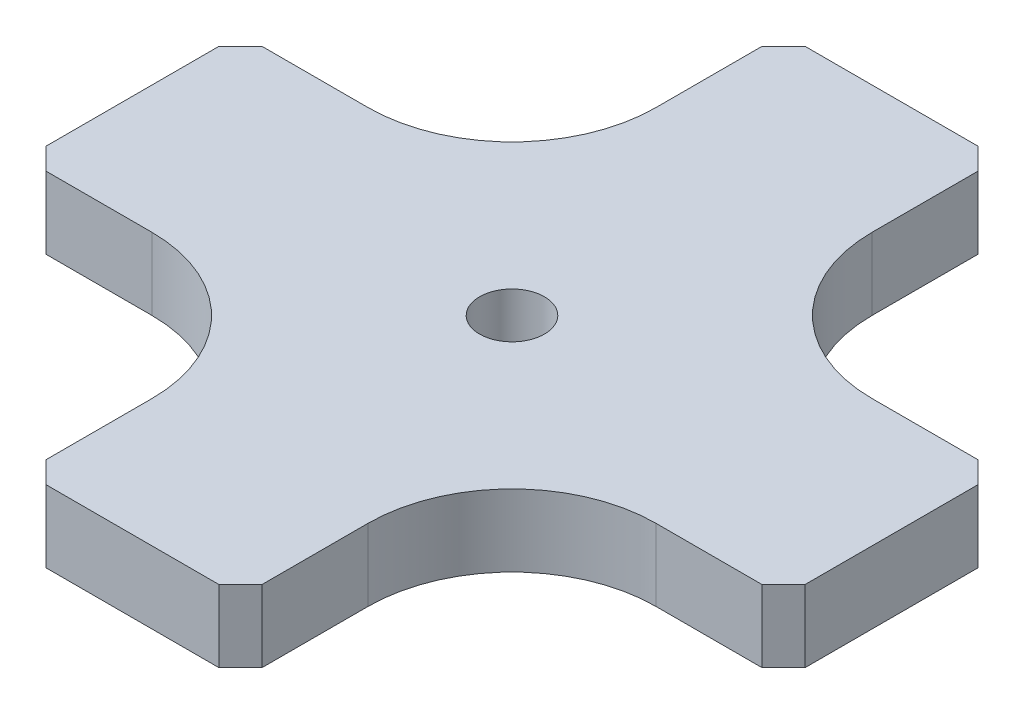
ISO-10303-21;
HEADER;
FILE_DESCRIPTION(('STEP AP214'),'2;1');
FILE_NAME('part.step','',(''),(''),'','','');
FILE_SCHEMA(('AUTOMOTIVE_DESIGN { 1 0 10303 214 1 1 1 1 }'));
ENDSEC;
DATA;
#1=APPLICATION_CONTEXT('core data for automotive mechanical design processes');
#2=APPLICATION_PROTOCOL_DEFINITION('international standard','automotive_design',2000,#1);
#3=PRODUCT_CONTEXT('',#1,'mechanical');
#4=PRODUCT('Part','Part','',(#3));
#5=PRODUCT_RELATED_PRODUCT_CATEGORY('part','',(#4));
#6=PRODUCT_DEFINITION_FORMATION('','',#4);
#7=PRODUCT_DEFINITION_CONTEXT('part definition',#1,'design');
#8=PRODUCT_DEFINITION('design','',#6,#7);
#9=PRODUCT_DEFINITION_SHAPE('','',#8);
#10=(LENGTH_UNIT() NAMED_UNIT(*) SI_UNIT(.MILLI.,.METRE.));
#11=(NAMED_UNIT(*) PLANE_ANGLE_UNIT() SI_UNIT($,.RADIAN.));
#12=(NAMED_UNIT(*) SI_UNIT($,.STERADIAN.) SOLID_ANGLE_UNIT());
#13=UNCERTAINTY_MEASURE_WITH_UNIT(LENGTH_MEASURE(1.E-05),#10,'distance_accuracy_value','');
#14=(GEOMETRIC_REPRESENTATION_CONTEXT(3) GLOBAL_UNCERTAINTY_ASSIGNED_CONTEXT((#13)) GLOBAL_UNIT_ASSIGNED_CONTEXT((#10,
#11,#12)) REPRESENTATION_CONTEXT('',''));
#15=CARTESIAN_POINT('',(0.,0.,0.));
#16=DIRECTION('',(0.,0.,1.));
#17=DIRECTION('',(1.,0.,0.));
#18=AXIS2_PLACEMENT_3D('',#15,#16,#17);
#19=CARTESIAN_POINT('',(26.35,2.5,-7.5));
#20=DIRECTION('',(0.,0.,1.));
#21=DIRECTION('',(1.,0.,0.));
#22=AXIS2_PLACEMENT_3D('',#19,#20,#21);
#23=PLANE('',#22);
#24=DIRECTION('',(-1.,0.,0.));
#25=VECTOR('',#24,1.);
#26=CARTESIAN_POINT('',(26.35,2.5,-7.5));
#27=LINE('',#26,#25);
#28=CARTESIAN_POINT('',(24.85,2.5,-7.5));
#29=VERTEX_POINT('',#28);
#30=CARTESIAN_POINT('',(17.5,2.5,-7.5));
#31=VERTEX_POINT('',#30);
#32=EDGE_CURVE('E271',#29,#31,#27,.T.);
#33=ORIENTED_EDGE('',*,*,#32,.F.);
#34=DIRECTION('',(0.,-1.,0.));
#35=VECTOR('',#34,1.);
#36=CARTESIAN_POINT('',(24.85,2.5,-7.5));
#37=LINE('',#36,#35);
#38=CARTESIAN_POINT('',(24.85,-2.5,-7.5));
#39=VERTEX_POINT('',#38);
#40=EDGE_CURVE('E395',#29,#39,#37,.T.);
#41=ORIENTED_EDGE('',*,*,#40,.T.);
#42=DIRECTION('',(-1.,0.,0.));
#43=VECTOR('',#42,1.);
#44=CARTESIAN_POINT('',(26.35,-2.5,-7.5));
#45=LINE('',#44,#43);
#46=CARTESIAN_POINT('',(17.5,-2.5,-7.5));
#47=VERTEX_POINT('',#46);
#48=EDGE_CURVE('E459',#39,#47,#45,.T.);
#49=ORIENTED_EDGE('',*,*,#48,.T.);
#50=DIRECTION('',(0.,-1.,0.));
#51=VECTOR('',#50,1.);
#52=CARTESIAN_POINT('',(17.5,2.5,-7.5));
#53=LINE('',#52,#51);
#54=EDGE_CURVE('E279',#47,#31,#53,.F.);
#55=ORIENTED_EDGE('',*,*,#54,.T.);
#56=EDGE_LOOP('',(#33,#41,#49,#55));
#57=FACE_BOUND('',#56,.T.);
#58=ADVANCED_FACE('F44',(#57),#23,.F.);
#59=CARTESIAN_POINT('',(7.49999999999998,2.5,-26.35));
#60=DIRECTION('',(-1.,0.,0.));
#61=DIRECTION('',(0.,0.,1.));
#62=AXIS2_PLACEMENT_3D('',#59,#60,#61);
#63=PLANE('',#62);
#64=DIRECTION('',(0.,0.,-1.));
#65=VECTOR('',#64,1.);
#66=CARTESIAN_POINT('',(7.49999999999998,-2.5,-26.35));
#67=LINE('',#66,#65);
#68=CARTESIAN_POINT('',(7.49999999999999,-2.5,-17.5));
#69=VERTEX_POINT('',#68);
#70=CARTESIAN_POINT('',(7.49999999999998,-2.5,-24.85));
#71=VERTEX_POINT('',#70);
#72=EDGE_CURVE('E462',#69,#71,#67,.T.);
#73=ORIENTED_EDGE('',*,*,#72,.T.);
#74=DIRECTION('',(0.,1.,0.));
#75=VECTOR('',#74,1.);
#76=CARTESIAN_POINT('',(7.49999999999998,2.5,-24.85));
#77=LINE('',#76,#75);
#78=CARTESIAN_POINT('',(7.49999999999998,2.5,-24.85));
#79=VERTEX_POINT('',#78);
#80=EDGE_CURVE('E392',#71,#79,#77,.T.);
#81=ORIENTED_EDGE('',*,*,#80,.T.);
#82=DIRECTION('',(0.,0.,-1.));
#83=VECTOR('',#82,1.);
#84=CARTESIAN_POINT('',(7.49999999999998,2.5,-26.35));
#85=LINE('',#84,#83);
#86=CARTESIAN_POINT('',(7.49999999999999,2.5,-17.5));
#87=VERTEX_POINT('',#86);
#88=EDGE_CURVE('E489',#87,#79,#85,.T.);
#89=ORIENTED_EDGE('',*,*,#88,.F.);
#90=DIRECTION('',(0.,-1.,0.));
#91=VECTOR('',#90,1.);
#92=CARTESIAN_POINT('',(7.49999999999999,-2.5,-17.5));
#93=LINE('',#92,#91);
#94=EDGE_CURVE('E275',#87,#69,#93,.T.);
#95=ORIENTED_EDGE('',*,*,#94,.T.);
#96=EDGE_LOOP('',(#73,#81,#89,#95));
#97=FACE_BOUND('',#96,.T.);
#98=ADVANCED_FACE('F536',(#97),#63,.F.);
#99=CARTESIAN_POINT('',(-7.50000000000003,2.5,-26.35));
#100=DIRECTION('',(0.,0.,1.));
#101=DIRECTION('',(1.,0.,0.));
#102=AXIS2_PLACEMENT_3D('',#99,#100,#101);
#103=PLANE('',#102);
#104=DIRECTION('',(-1.,0.,0.));
#105=VECTOR('',#104,1.);
#106=CARTESIAN_POINT('',(-7.50000000000003,-2.5,-26.35));
#107=LINE('',#106,#105);
#108=CARTESIAN_POINT('',(5.99999999999997,-2.5,-26.35));
#109=VERTEX_POINT('',#108);
#110=CARTESIAN_POINT('',(-6.00000000000002,-2.5,-26.35));
#111=VERTEX_POINT('',#110);
#112=EDGE_CURVE('E248',#109,#111,#107,.T.);
#113=ORIENTED_EDGE('',*,*,#112,.T.);
#114=DIRECTION('',(0.,1.,0.));
#115=VECTOR('',#114,1.);
#116=CARTESIAN_POINT('',(-6.00000000000002,2.5,-26.35));
#117=LINE('',#116,#115);
#118=CARTESIAN_POINT('',(-6.00000000000002,2.5,-26.35));
#119=VERTEX_POINT('',#118);
#120=EDGE_CURVE('E389',#111,#119,#117,.T.);
#121=ORIENTED_EDGE('',*,*,#120,.T.);
#122=DIRECTION('',(-1.,0.,0.));
#123=VECTOR('',#122,1.);
#124=CARTESIAN_POINT('',(-7.50000000000003,2.5,-26.35));
#125=LINE('',#124,#123);
#126=CARTESIAN_POINT('',(5.99999999999997,2.5,-26.35));
#127=VERTEX_POINT('',#126);
#128=EDGE_CURVE('E480',#127,#119,#125,.T.);
#129=ORIENTED_EDGE('',*,*,#128,.F.);
#130=DIRECTION('',(0.,-1.,0.));
#131=VECTOR('',#130,1.);
#132=CARTESIAN_POINT('',(5.99999999999997,2.5,-26.35));
#133=LINE('',#132,#131);
#134=EDGE_CURVE('E385',#127,#109,#133,.T.);
#135=ORIENTED_EDGE('',*,*,#134,.T.);
#136=EDGE_LOOP('',(#113,#121,#129,#135));
#137=FACE_BOUND('',#136,.T.);
#138=ADVANCED_FACE('F470',(#137),#103,.F.);
#139=CARTESIAN_POINT('',(-7.50000000000003,2.5,-26.35));
#140=DIRECTION('',(1.,0.,0.));
#141=DIRECTION('',(0.,0.,-1.));
#142=AXIS2_PLACEMENT_3D('',#139,#140,#141);
#143=PLANE('',#142);
#144=DIRECTION('',(0.,0.,1.));
#145=VECTOR('',#144,1.);
#146=CARTESIAN_POINT('',(-7.50000000000003,2.5,-26.35));
#147=LINE('',#146,#145);
#148=CARTESIAN_POINT('',(-7.50000000000003,2.5,-24.85));
#149=VERTEX_POINT('',#148);
#150=CARTESIAN_POINT('',(-7.50000000000002,2.5,-17.5));
#151=VERTEX_POINT('',#150);
#152=EDGE_CURVE('E479',#149,#151,#147,.T.);
#153=ORIENTED_EDGE('',*,*,#152,.F.);
#154=DIRECTION('',(0.,-1.,0.));
#155=VECTOR('',#154,1.);
#156=CARTESIAN_POINT('',(-7.50000000000003,2.5,-24.85));
#157=LINE('',#156,#155);
#158=CARTESIAN_POINT('',(-7.50000000000003,-2.5,-24.85));
#159=VERTEX_POINT('',#158);
#160=EDGE_CURVE('E381',#149,#159,#157,.T.);
#161=ORIENTED_EDGE('',*,*,#160,.T.);
#162=DIRECTION('',(0.,0.,1.));
#163=VECTOR('',#162,1.);
#164=CARTESIAN_POINT('',(-7.50000000000003,-2.5,-26.35));
#165=LINE('',#164,#163);
#166=CARTESIAN_POINT('',(-7.50000000000002,-2.5,-17.5));
#167=VERTEX_POINT('',#166);
#168=EDGE_CURVE('E241',#159,#167,#165,.T.);
#169=ORIENTED_EDGE('',*,*,#168,.T.);
#170=DIRECTION('',(0.,-1.,0.));
#171=VECTOR('',#170,1.);
#172=CARTESIAN_POINT('',(-7.50000000000002,2.5,-17.5));
#173=LINE('',#172,#171);
#174=EDGE_CURVE('E216',#167,#151,#173,.F.);
#175=ORIENTED_EDGE('',*,*,#174,.T.);
#176=EDGE_LOOP('',(#153,#161,#169,#175));
#177=FACE_BOUND('',#176,.T.);
#178=ADVANCED_FACE('F482',(#177),#143,.F.);
#179=CARTESIAN_POINT('',(-26.35,2.5,-7.5));
#180=DIRECTION('',(0.,0.,1.));
#181=DIRECTION('',(1.,0.,0.));
#182=AXIS2_PLACEMENT_3D('',#179,#180,#181);
#183=PLANE('',#182);
#184=DIRECTION('',(-1.,0.,0.));
#185=VECTOR('',#184,1.);
#186=CARTESIAN_POINT('',(-26.35,-2.5,-7.5));
#187=LINE('',#186,#185);
#188=CARTESIAN_POINT('',(-17.5,-2.5,-7.5));
#189=VERTEX_POINT('',#188);
#190=CARTESIAN_POINT('',(-24.85,-2.5,-7.5));
#191=VERTEX_POINT('',#190);
#192=EDGE_CURVE('E228',#189,#191,#187,.T.);
#193=ORIENTED_EDGE('',*,*,#192,.T.);
#194=DIRECTION('',(0.,1.,0.));
#195=VECTOR('',#194,1.);
#196=CARTESIAN_POINT('',(-24.85,2.5,-7.5));
#197=LINE('',#196,#195);
#198=CARTESIAN_POINT('',(-24.85,2.5,-7.5));
#199=VERTEX_POINT('',#198);
#200=EDGE_CURVE('E378',#191,#199,#197,.T.);
#201=ORIENTED_EDGE('',*,*,#200,.T.);
#202=DIRECTION('',(-1.,0.,0.));
#203=VECTOR('',#202,1.);
#204=CARTESIAN_POINT('',(-26.35,2.5,-7.5));
#205=LINE('',#204,#203);
#206=CARTESIAN_POINT('',(-17.5,2.5,-7.5));
#207=VERTEX_POINT('',#206);
#208=EDGE_CURVE('E231',#207,#199,#205,.T.);
#209=ORIENTED_EDGE('',*,*,#208,.F.);
#210=DIRECTION('',(0.,-1.,0.));
#211=VECTOR('',#210,1.);
#212=CARTESIAN_POINT('',(-17.5,-2.5,-7.5));
#213=LINE('',#212,#211);
#214=EDGE_CURVE('E214',#207,#189,#213,.T.);
#215=ORIENTED_EDGE('',*,*,#214,.T.);
#216=EDGE_LOOP('',(#193,#201,#209,#215));
#217=FACE_BOUND('',#216,.T.);
#218=ADVANCED_FACE('F227',(#217),#183,.F.);
#219=CARTESIAN_POINT('',(-26.35,2.5,7.50000000000001));
#220=DIRECTION('',(1.,0.,0.));
#221=DIRECTION('',(0.,0.,-1.));
#222=AXIS2_PLACEMENT_3D('',#219,#220,#221);
#223=PLANE('',#222);
#224=DIRECTION('',(0.,0.,1.));
#225=VECTOR('',#224,1.);
#226=CARTESIAN_POINT('',(-26.35,-2.5,7.50000000000001));
#227=LINE('',#226,#225);
#228=CARTESIAN_POINT('',(-26.35,-2.5,-5.99999999999999));
#229=VERTEX_POINT('',#228);
#230=CARTESIAN_POINT('',(-26.35,-2.5,6.));
#231=VERTEX_POINT('',#230);
#232=EDGE_CURVE('E240',#229,#231,#227,.T.);
#233=ORIENTED_EDGE('',*,*,#232,.T.);
#234=DIRECTION('',(0.,1.,0.));
#235=VECTOR('',#234,1.);
#236=CARTESIAN_POINT('',(-26.35,2.5,6.));
#237=LINE('',#236,#235);
#238=CARTESIAN_POINT('',(-26.35,2.5,6.));
#239=VERTEX_POINT('',#238);
#240=EDGE_CURVE('E352',#231,#239,#237,.T.);
#241=ORIENTED_EDGE('',*,*,#240,.T.);
#242=DIRECTION('',(0.,0.,1.));
#243=VECTOR('',#242,1.);
#244=CARTESIAN_POINT('',(-26.35,2.5,7.50000000000001));
#245=LINE('',#244,#243);
#246=CARTESIAN_POINT('',(-26.35,2.5,-5.99999999999999));
#247=VERTEX_POINT('',#246);
#248=EDGE_CURVE('E487',#247,#239,#245,.T.);
#249=ORIENTED_EDGE('',*,*,#248,.F.);
#250=DIRECTION('',(0.,-1.,0.));
#251=VECTOR('',#250,1.);
#252=CARTESIAN_POINT('',(-26.35,2.5,-5.99999999999999));
#253=LINE('',#252,#251);
#254=EDGE_CURVE('E348',#247,#229,#253,.T.);
#255=ORIENTED_EDGE('',*,*,#254,.T.);
#256=EDGE_LOOP('',(#233,#241,#249,#255));
#257=FACE_BOUND('',#256,.T.);
#258=ADVANCED_FACE('F520',(#257),#223,.F.);
#259=CARTESIAN_POINT('',(-26.35,2.5,7.50000000000001));
#260=DIRECTION('',(0.,0.,-1.));
#261=DIRECTION('',(-1.,0.,0.));
#262=AXIS2_PLACEMENT_3D('',#259,#260,#261);
#263=PLANE('',#262);
#264=DIRECTION('',(1.,0.,0.));
#265=VECTOR('',#264,1.);
#266=CARTESIAN_POINT('',(-26.35,2.5,7.50000000000001));
#267=LINE('',#266,#265);
#268=CARTESIAN_POINT('',(-24.85,2.5,7.50000000000001));
#269=VERTEX_POINT('',#268);
#270=CARTESIAN_POINT('',(-17.5,2.5,7.5));
#271=VERTEX_POINT('',#270);
#272=EDGE_CURVE('E495',#269,#271,#267,.T.);
#273=ORIENTED_EDGE('',*,*,#272,.F.);
#274=DIRECTION('',(0.,-1.,0.));
#275=VECTOR('',#274,1.);
#276=CARTESIAN_POINT('',(-24.85,2.5,7.50000000000001));
#277=LINE('',#276,#275);
#278=CARTESIAN_POINT('',(-24.85,-2.5,7.50000000000001));
#279=VERTEX_POINT('',#278);
#280=EDGE_CURVE('E321',#269,#279,#277,.T.);
#281=ORIENTED_EDGE('',*,*,#280,.T.);
#282=DIRECTION('',(1.,0.,0.));
#283=VECTOR('',#282,1.);
#284=CARTESIAN_POINT('',(-26.35,-2.5,7.50000000000001));
#285=LINE('',#284,#283);
#286=CARTESIAN_POINT('',(-17.5,-2.5,7.5));
#287=VERTEX_POINT('',#286);
#288=EDGE_CURVE('E246',#279,#287,#285,.T.);
#289=ORIENTED_EDGE('',*,*,#288,.T.);
#290=DIRECTION('',(0.,-1.,0.));
#291=VECTOR('',#290,1.);
#292=CARTESIAN_POINT('',(-17.5,2.5,7.5));
#293=LINE('',#292,#291);
#294=EDGE_CURVE('E222',#287,#271,#293,.F.);
#295=ORIENTED_EDGE('',*,*,#294,.T.);
#296=EDGE_LOOP('',(#273,#281,#289,#295));
#297=FACE_BOUND('',#296,.T.);
#298=ADVANCED_FACE('F512',(#297),#263,.F.);
#299=CARTESIAN_POINT('',(-7.50000000000003,2.5,26.35));
#300=DIRECTION('',(1.,0.,0.));
#301=DIRECTION('',(0.,0.,-1.));
#302=AXIS2_PLACEMENT_3D('',#299,#300,#301);
#303=PLANE('',#302);
#304=DIRECTION('',(0.,0.,1.));
#305=VECTOR('',#304,1.);
#306=CARTESIAN_POINT('',(-7.50000000000003,-2.5,26.35));
#307=LINE('',#306,#305);
#308=CARTESIAN_POINT('',(-7.50000000000002,-2.5,17.5));
#309=VERTEX_POINT('',#308);
#310=CARTESIAN_POINT('',(-7.50000000000003,-2.5,24.85));
#311=VERTEX_POINT('',#310);
#312=EDGE_CURVE('E254',#309,#311,#307,.T.);
#313=ORIENTED_EDGE('',*,*,#312,.T.);
#314=DIRECTION('',(0.,1.,0.));
#315=VECTOR('',#314,1.);
#316=CARTESIAN_POINT('',(-7.50000000000003,2.5,24.85));
#317=LINE('',#316,#315);
#318=CARTESIAN_POINT('',(-7.50000000000003,2.5,24.85));
#319=VERTEX_POINT('',#318);
#320=EDGE_CURVE('E11',#311,#319,#317,.T.);
#321=ORIENTED_EDGE('',*,*,#320,.T.);
#322=DIRECTION('',(0.,0.,1.));
#323=VECTOR('',#322,1.);
#324=CARTESIAN_POINT('',(-7.50000000000003,2.5,26.35));
#325=LINE('',#324,#323);
#326=CARTESIAN_POINT('',(-7.50000000000002,2.5,17.5));
#327=VERTEX_POINT('',#326);
#328=EDGE_CURVE('E434',#327,#319,#325,.T.);
#329=ORIENTED_EDGE('',*,*,#328,.F.);
#330=DIRECTION('',(0.,-1.,0.));
#331=VECTOR('',#330,1.);
#332=CARTESIAN_POINT('',(-7.50000000000002,-2.5,17.5));
#333=LINE('',#332,#331);
#334=EDGE_CURVE('E291',#327,#309,#333,.T.);
#335=ORIENTED_EDGE('',*,*,#334,.T.);
#336=EDGE_LOOP('',(#313,#321,#329,#335));
#337=FACE_BOUND('',#336,.T.);
#338=ADVANCED_FACE('F506',(#337),#303,.F.);
#339=CARTESIAN_POINT('',(-7.50000000000003,2.5,26.35));
#340=DIRECTION('',(0.,0.,-1.));
#341=DIRECTION('',(-1.,0.,0.));
#342=AXIS2_PLACEMENT_3D('',#339,#340,#341);
#343=PLANE('',#342);
#344=DIRECTION('',(1.,0.,0.));
#345=VECTOR('',#344,1.);
#346=CARTESIAN_POINT('',(-7.50000000000003,-2.5,26.35));
#347=LINE('',#346,#345);
#348=CARTESIAN_POINT('',(-6.00000000000002,-2.5,26.35));
#349=VERTEX_POINT('',#348);
#350=CARTESIAN_POINT('',(6.00000000000002,-2.5,26.35));
#351=VERTEX_POINT('',#350);
#352=EDGE_CURVE('E258',#349,#351,#347,.T.);
#353=ORIENTED_EDGE('',*,*,#352,.T.);
#354=DIRECTION('',(0.,1.,0.));
#355=VECTOR('',#354,1.);
#356=CARTESIAN_POINT('',(6.00000000000002,2.5,26.35));
#357=LINE('',#356,#355);
#358=CARTESIAN_POINT('',(6.00000000000002,2.5,26.35));
#359=VERTEX_POINT('',#358);
#360=EDGE_CURVE('E55',#351,#359,#357,.T.);
#361=ORIENTED_EDGE('',*,*,#360,.T.);
#362=DIRECTION('',(1.,0.,0.));
#363=VECTOR('',#362,1.);
#364=CARTESIAN_POINT('',(-7.50000000000003,2.5,26.35));
#365=LINE('',#364,#363);
#366=CARTESIAN_POINT('',(-6.00000000000002,2.5,26.35));
#367=VERTEX_POINT('',#366);
#368=EDGE_CURVE('E422',#367,#359,#365,.T.);
#369=ORIENTED_EDGE('',*,*,#368,.F.);
#370=DIRECTION('',(0.,-1.,0.));
#371=VECTOR('',#370,1.);
#372=CARTESIAN_POINT('',(-6.00000000000002,2.5,26.35));
#373=LINE('',#372,#371);
#374=EDGE_CURVE('E412',#367,#349,#373,.T.);
#375=ORIENTED_EDGE('',*,*,#374,.T.);
#376=EDGE_LOOP('',(#353,#361,#369,#375));
#377=FACE_BOUND('',#376,.T.);
#378=ADVANCED_FACE('F421',(#377),#343,.F.);
#379=CARTESIAN_POINT('',(7.50000000000003,2.5,26.35));
#380=DIRECTION('',(-1.,0.,0.));
#381=DIRECTION('',(0.,0.,1.));
#382=AXIS2_PLACEMENT_3D('',#379,#380,#381);
#383=PLANE('',#382);
#384=DIRECTION('',(0.,0.,-1.));
#385=VECTOR('',#384,1.);
#386=CARTESIAN_POINT('',(7.50000000000003,2.5,26.35));
#387=LINE('',#386,#385);
#388=CARTESIAN_POINT('',(7.50000000000003,2.5,24.85));
#389=VERTEX_POINT('',#388);
#390=CARTESIAN_POINT('',(7.50000000000002,2.5,17.5));
#391=VERTEX_POINT('',#390);
#392=EDGE_CURVE('E433',#389,#391,#387,.T.);
#393=ORIENTED_EDGE('',*,*,#392,.F.);
#394=DIRECTION('',(0.,-1.,0.));
#395=VECTOR('',#394,1.);
#396=CARTESIAN_POINT('',(7.50000000000003,2.5,24.85));
#397=LINE('',#396,#395);
#398=CARTESIAN_POINT('',(7.50000000000003,-2.5,24.85));
#399=VERTEX_POINT('',#398);
#400=EDGE_CURVE('E408',#389,#399,#397,.T.);
#401=ORIENTED_EDGE('',*,*,#400,.T.);
#402=DIRECTION('',(0.,0.,-1.));
#403=VECTOR('',#402,1.);
#404=CARTESIAN_POINT('',(7.50000000000003,-2.5,26.35));
#405=LINE('',#404,#403);
#406=CARTESIAN_POINT('',(7.50000000000002,-2.5,17.5));
#407=VERTEX_POINT('',#406);
#408=EDGE_CURVE('E262',#399,#407,#405,.T.);
#409=ORIENTED_EDGE('',*,*,#408,.T.);
#410=DIRECTION('',(0.,-1.,0.));
#411=VECTOR('',#410,1.);
#412=CARTESIAN_POINT('',(7.50000000000002,2.5,17.5));
#413=LINE('',#412,#411);
#414=EDGE_CURVE('E287',#407,#391,#413,.F.);
#415=ORIENTED_EDGE('',*,*,#414,.T.);
#416=EDGE_LOOP('',(#393,#401,#409,#415));
#417=FACE_BOUND('',#416,.T.);
#418=ADVANCED_FACE('F440',(#417),#383,.F.);
#419=CARTESIAN_POINT('',(26.35,2.5,7.50000000000001));
#420=DIRECTION('',(0.,0.,-1.));
#421=DIRECTION('',(-1.,0.,0.));
#422=AXIS2_PLACEMENT_3D('',#419,#420,#421);
#423=PLANE('',#422);
#424=DIRECTION('',(1.,0.,0.));
#425=VECTOR('',#424,1.);
#426=CARTESIAN_POINT('',(26.35,-2.5,7.50000000000001));
#427=LINE('',#426,#425);
#428=CARTESIAN_POINT('',(17.5,-2.5,7.5));
#429=VERTEX_POINT('',#428);
#430=CARTESIAN_POINT('',(24.85,-2.5,7.50000000000001));
#431=VERTEX_POINT('',#430);
#432=EDGE_CURVE('E265',#429,#431,#427,.T.);
#433=ORIENTED_EDGE('',*,*,#432,.T.);
#434=DIRECTION('',(0.,1.,0.));
#435=VECTOR('',#434,1.);
#436=CARTESIAN_POINT('',(24.85,2.5,7.50000000000001));
#437=LINE('',#436,#435);
#438=CARTESIAN_POINT('',(24.85,2.5,7.50000000000001));
#439=VERTEX_POINT('',#438);
#440=EDGE_CURVE('E405',#431,#439,#437,.T.);
#441=ORIENTED_EDGE('',*,*,#440,.T.);
#442=DIRECTION('',(1.,0.,0.));
#443=VECTOR('',#442,1.);
#444=CARTESIAN_POINT('',(26.35,2.5,7.50000000000001));
#445=LINE('',#444,#443);
#446=CARTESIAN_POINT('',(17.5,2.5,7.5));
#447=VERTEX_POINT('',#446);
#448=EDGE_CURVE('E448',#447,#439,#445,.T.);
#449=ORIENTED_EDGE('',*,*,#448,.F.);
#450=DIRECTION('',(0.,-1.,0.));
#451=VECTOR('',#450,1.);
#452=CARTESIAN_POINT('',(17.5,-2.5,7.5));
#453=LINE('',#452,#451);
#454=EDGE_CURVE('E283',#447,#429,#453,.T.);
#455=ORIENTED_EDGE('',*,*,#454,.T.);
#456=EDGE_LOOP('',(#433,#441,#449,#455));
#457=FACE_BOUND('',#456,.T.);
#458=ADVANCED_FACE('F450',(#457),#423,.F.);
#459=CARTESIAN_POINT('',(26.35,2.5,7.50000000000001));
#460=DIRECTION('',(-1.,0.,0.));
#461=DIRECTION('',(0.,0.,1.));
#462=AXIS2_PLACEMENT_3D('',#459,#460,#461);
#463=PLANE('',#462);
#464=DIRECTION('',(0.,0.,-1.));
#465=VECTOR('',#464,1.);
#466=CARTESIAN_POINT('',(26.35,-2.5,7.50000000000001));
#467=LINE('',#466,#465);
#468=CARTESIAN_POINT('',(26.35,-2.5,6.));
#469=VERTEX_POINT('',#468);
#470=CARTESIAN_POINT('',(26.35,-2.5,-5.99999999999998));
#471=VERTEX_POINT('',#470);
#472=EDGE_CURVE('E269',#469,#471,#467,.T.);
#473=ORIENTED_EDGE('',*,*,#472,.T.);
#474=DIRECTION('',(0.,1.,0.));
#475=VECTOR('',#474,1.);
#476=CARTESIAN_POINT('',(26.35,2.5,-5.99999999999998));
#477=LINE('',#476,#475);
#478=CARTESIAN_POINT('',(26.35,2.5,-5.99999999999998));
#479=VERTEX_POINT('',#478);
#480=EDGE_CURVE('E62',#471,#479,#477,.T.);
#481=ORIENTED_EDGE('',*,*,#480,.T.);
#482=DIRECTION('',(0.,0.,-1.));
#483=VECTOR('',#482,1.);
#484=CARTESIAN_POINT('',(26.35,2.5,7.50000000000001));
#485=LINE('',#484,#483);
#486=CARTESIAN_POINT('',(26.35,2.5,6.));
#487=VERTEX_POINT('',#486);
#488=EDGE_CURVE('E233',#487,#479,#485,.T.);
#489=ORIENTED_EDGE('',*,*,#488,.F.);
#490=DIRECTION('',(0.,-1.,0.));
#491=VECTOR('',#490,1.);
#492=CARTESIAN_POINT('',(26.35,2.5,6.));
#493=LINE('',#492,#491);
#494=EDGE_CURVE('E399',#487,#469,#493,.T.);
#495=ORIENTED_EDGE('',*,*,#494,.T.);
#496=EDGE_LOOP('',(#473,#481,#489,#495));
#497=FACE_BOUND('',#496,.T.);
#498=ADVANCED_FACE('F596',(#497),#463,.F.);
#499=CARTESIAN_POINT('',(0.,2.5,0.));
#500=DIRECTION('',(0.,1.,0.));
#501=DIRECTION('',(0.,0.,1.));
#502=AXIS2_PLACEMENT_3D('',#499,#500,#501);
#503=PLANE('',#502);
#504=CARTESIAN_POINT('',(0.,2.5,0.));
#505=DIRECTION('',(0.,1.,0.));
#506=DIRECTION('',(0.,0.,1.));
#507=AXIS2_PLACEMENT_3D('',#504,#505,#506);
#508=CIRCLE('',#507,2.24999999999999);
#509=CARTESIAN_POINT('',(0.,2.5,2.24999999999999));
#510=VERTEX_POINT('',#509);
#511=EDGE_CURVE('E607',#510,#510,#508,.T.);
#512=ORIENTED_EDGE('',*,*,#511,.F.);
#513=EDGE_LOOP('',(#512));
#514=FACE_BOUND('',#513,.T.);
#515=ORIENTED_EDGE('',*,*,#248,.T.);
#516=DIRECTION('',(-0.707106781186546,0.,-0.707106781186549));
#517=VECTOR('',#516,1.);
#518=CARTESIAN_POINT('',(-16.1750000000001,2.5,16.175));
#519=LINE('',#518,#517);
#520=EDGE_CURVE('E375',#239,#269,#519,.F.);
#521=ORIENTED_EDGE('',*,*,#520,.T.);
#522=ORIENTED_EDGE('',*,*,#272,.T.);
#523=CARTESIAN_POINT('',(-17.5,2.5,17.5));
#524=DIRECTION('',(0.,1.,0.));
#525=DIRECTION('',(0.,0.,1.));
#526=AXIS2_PLACEMENT_3D('',#523,#524,#525);
#527=CIRCLE('',#526,10.);
#528=EDGE_CURVE('E318',#271,#327,#527,.F.);
#529=ORIENTED_EDGE('',*,*,#528,.T.);
#530=ORIENTED_EDGE('',*,*,#328,.T.);
#531=DIRECTION('',(-0.707106781186544,0.,-0.707106781186551));
#532=VECTOR('',#531,1.);
#533=CARTESIAN_POINT('',(-16.175,2.5,16.1749999999999));
#534=LINE('',#533,#532);
#535=EDGE_CURVE('E355',#319,#367,#534,.F.);
#536=ORIENTED_EDGE('',*,*,#535,.T.);
#537=ORIENTED_EDGE('',*,*,#368,.T.);
#538=DIRECTION('',(-0.707106781186551,0.,0.707106781186544));
#539=VECTOR('',#538,1.);
#540=CARTESIAN_POINT('',(16.175,2.5,16.1750000000001));
#541=LINE('',#540,#539);
#542=EDGE_CURVE('E358',#359,#389,#541,.F.);
#543=ORIENTED_EDGE('',*,*,#542,.T.);
#544=ORIENTED_EDGE('',*,*,#392,.T.);
#545=CARTESIAN_POINT('',(17.5,2.5,17.5));
#546=DIRECTION('',(0.,1.,0.));
#547=DIRECTION('',(0.,0.,1.));
#548=AXIS2_PLACEMENT_3D('',#545,#546,#547);
#549=CIRCLE('',#548,10.);
#550=EDGE_CURVE('E311',#391,#447,#549,.F.);
#551=ORIENTED_EDGE('',*,*,#550,.T.);
#552=ORIENTED_EDGE('',*,*,#448,.T.);
#553=DIRECTION('',(-0.707106781186549,0.,0.707106781186546));
#554=VECTOR('',#553,1.);
#555=CARTESIAN_POINT('',(16.1749999999999,2.5,16.175));
#556=LINE('',#555,#554);
#557=EDGE_CURVE('E69',#439,#487,#556,.F.);
#558=ORIENTED_EDGE('',*,*,#557,.T.);
#559=ORIENTED_EDGE('',*,*,#488,.T.);
#560=DIRECTION('',(0.707106781186544,0.,0.707106781186551));
#561=VECTOR('',#560,1.);
#562=CARTESIAN_POINT('',(16.1750000000001,2.5,-16.175));
#563=LINE('',#562,#561);
#564=EDGE_CURVE('E363',#479,#29,#563,.F.);
#565=ORIENTED_EDGE('',*,*,#564,.T.);
#566=ORIENTED_EDGE('',*,*,#32,.T.);
#567=CARTESIAN_POINT('',(17.5,2.5,-17.5));
#568=DIRECTION('',(0.,1.,0.));
#569=DIRECTION('',(0.,0.,1.));
#570=AXIS2_PLACEMENT_3D('',#567,#568,#569);
#571=CIRCLE('',#570,10.);
#572=EDGE_CURVE('E304',#31,#87,#571,.F.);
#573=ORIENTED_EDGE('',*,*,#572,.T.);
#574=ORIENTED_EDGE('',*,*,#88,.T.);
#575=DIRECTION('',(0.707106781186548,0.,0.707106781186547));
#576=VECTOR('',#575,1.);
#577=CARTESIAN_POINT('',(16.175,2.5,-16.175));
#578=LINE('',#577,#576);
#579=EDGE_CURVE('E366',#79,#127,#578,.F.);
#580=ORIENTED_EDGE('',*,*,#579,.T.);
#581=ORIENTED_EDGE('',*,*,#128,.T.);
#582=DIRECTION('',(0.707106781186548,0.,-0.707106781186548));
#583=VECTOR('',#582,1.);
#584=CARTESIAN_POINT('',(-16.175,2.5,-16.175));
#585=LINE('',#584,#583);
#586=EDGE_CURVE('E369',#119,#149,#585,.F.);
#587=ORIENTED_EDGE('',*,*,#586,.T.);
#588=ORIENTED_EDGE('',*,*,#152,.T.);
#589=CARTESIAN_POINT('',(-17.5,2.5,-17.5));
#590=DIRECTION('',(0.,1.,0.));
#591=DIRECTION('',(0.,0.,1.));
#592=AXIS2_PLACEMENT_3D('',#589,#590,#591);
#593=CIRCLE('',#592,10.);
#594=EDGE_CURVE('E221',#151,#207,#593,.F.);
#595=ORIENTED_EDGE('',*,*,#594,.T.);
#596=ORIENTED_EDGE('',*,*,#208,.T.);
#597=DIRECTION('',(0.707106781186549,0.,-0.707106781186546));
#598=VECTOR('',#597,1.);
#599=CARTESIAN_POINT('',(-16.1749999999999,2.5,-16.175));
#600=LINE('',#599,#598);
#601=EDGE_CURVE('E372',#199,#247,#600,.F.);
#602=ORIENTED_EDGE('',*,*,#601,.T.);
#603=EDGE_LOOP('',(#515,#521,#522,#529,#530,#536,#537,#543,#544,#551,#552,#558,#559,#565,#566,
#573,#574,#580,#581,#587,#588,#595,#596,#602));
#604=FACE_BOUND('',#603,.T.);
#605=ADVANCED_FACE('F428',(#514,#604),#503,.T.);
#606=CARTESIAN_POINT('',(0.,-2.5,0.));
#607=DIRECTION('',(0.,1.,0.));
#608=DIRECTION('',(0.,0.,1.));
#609=AXIS2_PLACEMENT_3D('',#606,#607,#608);
#610=PLANE('',#609);
#611=CARTESIAN_POINT('',(0.,-2.5,0.));
#612=DIRECTION('',(0.,1.,0.));
#613=DIRECTION('',(0.,0.,1.));
#614=AXIS2_PLACEMENT_3D('',#611,#612,#613);
#615=CIRCLE('',#614,2.24999999999999);
#616=CARTESIAN_POINT('',(0.,-2.5,2.24999999999999));
#617=VERTEX_POINT('',#616);
#618=EDGE_CURVE('E49',#617,#617,#615,.T.);
#619=ORIENTED_EDGE('',*,*,#618,.T.);
#620=EDGE_LOOP('',(#619));
#621=FACE_BOUND('',#620,.T.);
#622=ORIENTED_EDGE('',*,*,#288,.F.);
#623=DIRECTION('',(0.707106781186546,0.,0.707106781186549));
#624=VECTOR('',#623,1.);
#625=CARTESIAN_POINT('',(-24.85,-2.5,7.50000000000001));
#626=LINE('',#625,#624);
#627=EDGE_CURVE('E345',#279,#231,#626,.F.);
#628=ORIENTED_EDGE('',*,*,#627,.T.);
#629=ORIENTED_EDGE('',*,*,#232,.F.);
#630=DIRECTION('',(-0.707106781186549,0.,0.707106781186546));
#631=VECTOR('',#630,1.);
#632=CARTESIAN_POINT('',(-26.35,-2.5,-5.99999999999999));
#633=LINE('',#632,#631);
#634=EDGE_CURVE('E238',#229,#191,#633,.F.);
#635=ORIENTED_EDGE('',*,*,#634,.T.);
#636=ORIENTED_EDGE('',*,*,#192,.F.);
#637=CARTESIAN_POINT('',(-17.5,-2.5,-17.5));
#638=DIRECTION('',(0.,1.,0.));
#639=DIRECTION('',(0.,0.,1.));
#640=AXIS2_PLACEMENT_3D('',#637,#638,#639);
#641=CIRCLE('',#640,10.);
#642=EDGE_CURVE('E210',#189,#167,#641,.T.);
#643=ORIENTED_EDGE('',*,*,#642,.T.);
#644=ORIENTED_EDGE('',*,*,#168,.F.);
#645=DIRECTION('',(-0.707106781186548,0.,0.707106781186548));
#646=VECTOR('',#645,1.);
#647=CARTESIAN_POINT('',(-7.50000000000003,-2.5,-24.85));
#648=LINE('',#647,#646);
#649=EDGE_CURVE('E340',#159,#111,#648,.F.);
#650=ORIENTED_EDGE('',*,*,#649,.T.);
#651=ORIENTED_EDGE('',*,*,#112,.F.);
#652=DIRECTION('',(-0.707106781186548,0.,-0.707106781186547));
#653=VECTOR('',#652,1.);
#654=CARTESIAN_POINT('',(5.99999999999997,-2.5,-26.35));
#655=LINE('',#654,#653);
#656=EDGE_CURVE('E337',#109,#71,#655,.F.);
#657=ORIENTED_EDGE('',*,*,#656,.T.);
#658=ORIENTED_EDGE('',*,*,#72,.F.);
#659=CARTESIAN_POINT('',(17.5,-2.5,-17.5));
#660=DIRECTION('',(0.,1.,0.));
#661=DIRECTION('',(0.,0.,1.));
#662=AXIS2_PLACEMENT_3D('',#659,#660,#661);
#663=CIRCLE('',#662,10.);
#664=EDGE_CURVE('E300',#69,#47,#663,.T.);
#665=ORIENTED_EDGE('',*,*,#664,.T.);
#666=ORIENTED_EDGE('',*,*,#48,.F.);
#667=DIRECTION('',(-0.707106781186544,0.,-0.707106781186551));
#668=VECTOR('',#667,1.);
#669=CARTESIAN_POINT('',(24.85,-2.5,-7.5));
#670=LINE('',#669,#668);
#671=EDGE_CURVE('E334',#39,#471,#670,.F.);
#672=ORIENTED_EDGE('',*,*,#671,.T.);
#673=ORIENTED_EDGE('',*,*,#472,.F.);
#674=DIRECTION('',(0.707106781186549,0.,-0.707106781186546));
#675=VECTOR('',#674,1.);
#676=CARTESIAN_POINT('',(26.35,-2.5,6.));
#677=LINE('',#676,#675);
#678=EDGE_CURVE('E331',#469,#431,#677,.F.);
#679=ORIENTED_EDGE('',*,*,#678,.T.);
#680=ORIENTED_EDGE('',*,*,#432,.F.);
#681=CARTESIAN_POINT('',(17.5,-2.5,17.5));
#682=DIRECTION('',(0.,1.,0.));
#683=DIRECTION('',(0.,0.,1.));
#684=AXIS2_PLACEMENT_3D('',#681,#682,#683);
#685=CIRCLE('',#684,10.);
#686=EDGE_CURVE('E307',#429,#407,#685,.T.);
#687=ORIENTED_EDGE('',*,*,#686,.T.);
#688=ORIENTED_EDGE('',*,*,#408,.F.);
#689=DIRECTION('',(0.707106781186551,0.,-0.707106781186544));
#690=VECTOR('',#689,1.);
#691=CARTESIAN_POINT('',(7.50000000000003,-2.5,24.85));
#692=LINE('',#691,#690);
#693=EDGE_CURVE('E328',#399,#351,#692,.F.);
#694=ORIENTED_EDGE('',*,*,#693,.T.);
#695=ORIENTED_EDGE('',*,*,#352,.F.);
#696=DIRECTION('',(0.707106781186544,0.,0.707106781186551));
#697=VECTOR('',#696,1.);
#698=CARTESIAN_POINT('',(-6.00000000000002,-2.5,26.35));
#699=LINE('',#698,#697);
#700=EDGE_CURVE('E325',#349,#311,#699,.F.);
#701=ORIENTED_EDGE('',*,*,#700,.T.);
#702=ORIENTED_EDGE('',*,*,#312,.F.);
#703=CARTESIAN_POINT('',(-17.5,-2.5,17.5));
#704=DIRECTION('',(0.,1.,0.));
#705=DIRECTION('',(0.,0.,1.));
#706=AXIS2_PLACEMENT_3D('',#703,#704,#705);
#707=CIRCLE('',#706,10.);
#708=EDGE_CURVE('E314',#309,#287,#707,.T.);
#709=ORIENTED_EDGE('',*,*,#708,.T.);
#710=EDGE_LOOP('',(#622,#628,#629,#635,#636,#643,#644,#650,#651,#657,#658,#665,#666,#672,#673,
#679,#680,#687,#688,#694,#695,#701,#702,#709));
#711=FACE_BOUND('',#710,.T.);
#712=ADVANCED_FACE('F236',(#621,#711),#610,.F.);
#713=CARTESIAN_POINT('',(-17.5,2.5,-17.5));
#714=DIRECTION('',(0.,1.,0.));
#715=DIRECTION('',(0.,0.,1.));
#716=AXIS2_PLACEMENT_3D('',#713,#714,#715);
#717=CYLINDRICAL_SURFACE('',#716,10.);
#718=ORIENTED_EDGE('',*,*,#594,.F.);
#719=ORIENTED_EDGE('',*,*,#174,.F.);
#720=ORIENTED_EDGE('',*,*,#642,.F.);
#721=ORIENTED_EDGE('',*,*,#214,.F.);
#722=EDGE_LOOP('',(#718,#719,#720,#721));
#723=FACE_BOUND('',#722,.T.);
#724=ADVANCED_FACE('F213',(#723),#717,.F.);
#725=CARTESIAN_POINT('',(17.5,2.5,-17.5));
#726=DIRECTION('',(0.,1.,0.));
#727=DIRECTION('',(0.,0.,1.));
#728=AXIS2_PLACEMENT_3D('',#725,#726,#727);
#729=CYLINDRICAL_SURFACE('',#728,10.);
#730=ORIENTED_EDGE('',*,*,#572,.F.);
#731=ORIENTED_EDGE('',*,*,#54,.F.);
#732=ORIENTED_EDGE('',*,*,#664,.F.);
#733=ORIENTED_EDGE('',*,*,#94,.F.);
#734=EDGE_LOOP('',(#730,#731,#732,#733));
#735=FACE_BOUND('',#734,.T.);
#736=ADVANCED_FACE('F549',(#735),#729,.F.);
#737=CARTESIAN_POINT('',(17.5,2.5,17.5));
#738=DIRECTION('',(0.,1.,0.));
#739=DIRECTION('',(0.,0.,1.));
#740=AXIS2_PLACEMENT_3D('',#737,#738,#739);
#741=CYLINDRICAL_SURFACE('',#740,10.);
#742=ORIENTED_EDGE('',*,*,#550,.F.);
#743=ORIENTED_EDGE('',*,*,#414,.F.);
#744=ORIENTED_EDGE('',*,*,#686,.F.);
#745=ORIENTED_EDGE('',*,*,#454,.F.);
#746=EDGE_LOOP('',(#742,#743,#744,#745));
#747=FACE_BOUND('',#746,.T.);
#748=ADVANCED_FACE('F446',(#747),#741,.F.);
#749=CARTESIAN_POINT('',(-17.5,2.5,17.5));
#750=DIRECTION('',(0.,1.,0.));
#751=DIRECTION('',(0.,0.,1.));
#752=AXIS2_PLACEMENT_3D('',#749,#750,#751);
#753=CYLINDRICAL_SURFACE('',#752,10.);
#754=ORIENTED_EDGE('',*,*,#528,.F.);
#755=ORIENTED_EDGE('',*,*,#294,.F.);
#756=ORIENTED_EDGE('',*,*,#708,.F.);
#757=ORIENTED_EDGE('',*,*,#334,.F.);
#758=EDGE_LOOP('',(#754,#755,#756,#757));
#759=FACE_BOUND('',#758,.T.);
#760=ADVANCED_FACE('F508',(#759),#753,.F.);
#761=CARTESIAN_POINT('',(-24.85,2.5,7.50000000000001));
#762=DIRECTION('',(0.707106781186549,0.,-0.707106781186546));
#763=DIRECTION('',(0.,-1.,0.));
#764=AXIS2_PLACEMENT_3D('',#761,#762,#763);
#765=PLANE('',#764);
#766=ORIENTED_EDGE('',*,*,#520,.F.);
#767=ORIENTED_EDGE('',*,*,#240,.F.);
#768=ORIENTED_EDGE('',*,*,#627,.F.);
#769=ORIENTED_EDGE('',*,*,#280,.F.);
#770=EDGE_LOOP('',(#766,#767,#768,#769));
#771=FACE_BOUND('',#770,.T.);
#772=ADVANCED_FACE('F516',(#771),#765,.F.);
#773=CARTESIAN_POINT('',(-26.35,2.5,-5.99999999999999));
#774=DIRECTION('',(0.707106781186546,0.,0.707106781186549));
#775=DIRECTION('',(0.,-1.,0.));
#776=AXIS2_PLACEMENT_3D('',#773,#774,#775);
#777=PLANE('',#776);
#778=ORIENTED_EDGE('',*,*,#601,.F.);
#779=ORIENTED_EDGE('',*,*,#200,.F.);
#780=ORIENTED_EDGE('',*,*,#634,.F.);
#781=ORIENTED_EDGE('',*,*,#254,.F.);
#782=EDGE_LOOP('',(#778,#779,#780,#781));
#783=FACE_BOUND('',#782,.T.);
#784=ADVANCED_FACE('F524',(#783),#777,.F.);
#785=CARTESIAN_POINT('',(-7.50000000000003,2.5,-24.85));
#786=DIRECTION('',(0.707106781186547,0.,0.707106781186547));
#787=DIRECTION('',(0.,-1.,0.));
#788=AXIS2_PLACEMENT_3D('',#785,#786,#787);
#789=PLANE('',#788);
#790=ORIENTED_EDGE('',*,*,#586,.F.);
#791=ORIENTED_EDGE('',*,*,#120,.F.);
#792=ORIENTED_EDGE('',*,*,#649,.F.);
#793=ORIENTED_EDGE('',*,*,#160,.F.);
#794=EDGE_LOOP('',(#790,#791,#792,#793));
#795=FACE_BOUND('',#794,.T.);
#796=ADVANCED_FACE('F476',(#795),#789,.F.);
#797=CARTESIAN_POINT('',(5.99999999999997,2.5,-26.35));
#798=DIRECTION('',(-0.707106781186547,0.,0.707106781186548));
#799=DIRECTION('',(0.,-1.,0.));
#800=AXIS2_PLACEMENT_3D('',#797,#798,#799);
#801=PLANE('',#800);
#802=ORIENTED_EDGE('',*,*,#579,.F.);
#803=ORIENTED_EDGE('',*,*,#80,.F.);
#804=ORIENTED_EDGE('',*,*,#656,.F.);
#805=ORIENTED_EDGE('',*,*,#134,.F.);
#806=EDGE_LOOP('',(#802,#803,#804,#805));
#807=FACE_BOUND('',#806,.T.);
#808=ADVANCED_FACE('F531',(#807),#801,.F.);
#809=CARTESIAN_POINT('',(24.85,2.5,-7.5));
#810=DIRECTION('',(-0.707106781186551,0.,0.707106781186544));
#811=DIRECTION('',(0.,-1.,0.));
#812=AXIS2_PLACEMENT_3D('',#809,#810,#811);
#813=PLANE('',#812);
#814=ORIENTED_EDGE('',*,*,#564,.F.);
#815=ORIENTED_EDGE('',*,*,#480,.F.);
#816=ORIENTED_EDGE('',*,*,#671,.F.);
#817=ORIENTED_EDGE('',*,*,#40,.F.);
#818=EDGE_LOOP('',(#814,#815,#816,#817));
#819=FACE_BOUND('',#818,.T.);
#820=ADVANCED_FACE('F573',(#819),#813,.F.);
#821=CARTESIAN_POINT('',(26.35,2.5,6.));
#822=DIRECTION('',(-0.707106781186546,0.,-0.707106781186549));
#823=DIRECTION('',(0.,-1.,0.));
#824=AXIS2_PLACEMENT_3D('',#821,#822,#823);
#825=PLANE('',#824);
#826=ORIENTED_EDGE('',*,*,#557,.F.);
#827=ORIENTED_EDGE('',*,*,#440,.F.);
#828=ORIENTED_EDGE('',*,*,#678,.F.);
#829=ORIENTED_EDGE('',*,*,#494,.F.);
#830=EDGE_LOOP('',(#826,#827,#828,#829));
#831=FACE_BOUND('',#830,.T.);
#832=ADVANCED_FACE('F578',(#831),#825,.F.);
#833=CARTESIAN_POINT('',(7.50000000000003,2.5,24.85));
#834=DIRECTION('',(-0.707106781186544,0.,-0.707106781186551));
#835=DIRECTION('',(0.,-1.,0.));
#836=AXIS2_PLACEMENT_3D('',#833,#834,#835);
#837=PLANE('',#836);
#838=ORIENTED_EDGE('',*,*,#542,.F.);
#839=ORIENTED_EDGE('',*,*,#360,.F.);
#840=ORIENTED_EDGE('',*,*,#693,.F.);
#841=ORIENTED_EDGE('',*,*,#400,.F.);
#842=EDGE_LOOP('',(#838,#839,#840,#841));
#843=FACE_BOUND('',#842,.T.);
#844=ADVANCED_FACE('F437',(#843),#837,.F.);
#845=CARTESIAN_POINT('',(-6.00000000000002,2.5,26.35));
#846=DIRECTION('',(0.707106781186551,0.,-0.707106781186544));
#847=DIRECTION('',(0.,-1.,0.));
#848=AXIS2_PLACEMENT_3D('',#845,#846,#847);
#849=PLANE('',#848);
#850=ORIENTED_EDGE('',*,*,#535,.F.);
#851=ORIENTED_EDGE('',*,*,#320,.F.);
#852=ORIENTED_EDGE('',*,*,#700,.F.);
#853=ORIENTED_EDGE('',*,*,#374,.F.);
#854=EDGE_LOOP('',(#850,#851,#852,#853));
#855=FACE_BOUND('',#854,.T.);
#856=ADVANCED_FACE('F47',(#855),#849,.F.);
#857=CARTESIAN_POINT('',(0.,2.5,0.));
#858=DIRECTION('',(0.,1.,0.));
#859=DIRECTION('',(0.,0.,1.));
#860=AXIS2_PLACEMENT_3D('',#857,#858,#859);
#861=CYLINDRICAL_SURFACE('',#860,2.24999999999999);
#862=ORIENTED_EDGE('',*,*,#511,.T.);
#863=EDGE_LOOP('',(#862));
#864=FACE_BOUND('',#863,.T.);
#865=ORIENTED_EDGE('',*,*,#618,.F.);
#866=EDGE_LOOP('',(#865));
#867=FACE_BOUND('',#866,.T.);
#868=ADVANCED_FACE('F588',(#864,#867),#861,.F.);
#869=CLOSED_SHELL('',(#58,#98,#138,#178,#218,#258,#298,#338,#378,#418,#458,#498,#605,#712,#724,
#736,#748,#760,#772,#784,#796,#808,#820,#832,#844,#856,#868));
#870=MANIFOLD_SOLID_BREP('B2',#869);
#871=ADVANCED_BREP_SHAPE_REPRESENTATION('',(#18,#870),#14);
#872=SHAPE_DEFINITION_REPRESENTATION(#9,#871);
ENDSEC;
END-ISO-10303-21;
